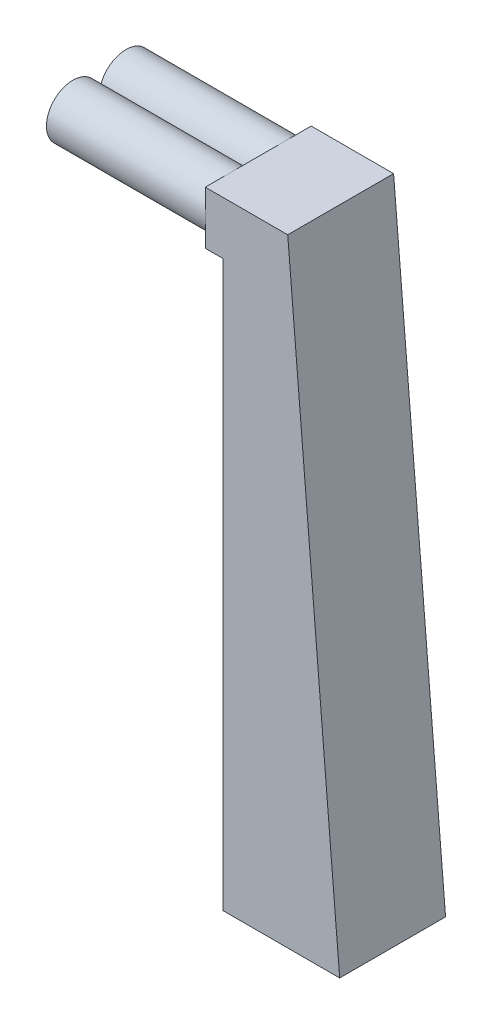
ISO-10303-21;
HEADER;
FILE_DESCRIPTION(('STEP AP214'),'2;1');
FILE_NAME('part.step','',(''),(''),'','','');
FILE_SCHEMA(('AUTOMOTIVE_DESIGN { 1 0 10303 214 1 1 1 1 }'));
ENDSEC;
DATA;
#1=APPLICATION_CONTEXT('core data for automotive mechanical design processes');
#2=APPLICATION_PROTOCOL_DEFINITION('international standard','automotive_design',2000,#1);
#3=PRODUCT_CONTEXT('',#1,'mechanical');
#4=PRODUCT('Part','Part','',(#3));
#5=PRODUCT_RELATED_PRODUCT_CATEGORY('part','',(#4));
#6=PRODUCT_DEFINITION_FORMATION('','',#4);
#7=PRODUCT_DEFINITION_CONTEXT('part definition',#1,'design');
#8=PRODUCT_DEFINITION('design','',#6,#7);
#9=PRODUCT_DEFINITION_SHAPE('','',#8);
#10=(LENGTH_UNIT() NAMED_UNIT(*) SI_UNIT(.MILLI.,.METRE.));
#11=(NAMED_UNIT(*) PLANE_ANGLE_UNIT() SI_UNIT($,.RADIAN.));
#12=(NAMED_UNIT(*) SI_UNIT($,.STERADIAN.) SOLID_ANGLE_UNIT());
#13=UNCERTAINTY_MEASURE_WITH_UNIT(LENGTH_MEASURE(1.E-05),#10,'distance_accuracy_value','');
#14=(GEOMETRIC_REPRESENTATION_CONTEXT(3) GLOBAL_UNCERTAINTY_ASSIGNED_CONTEXT((#13)) GLOBAL_UNIT_ASSIGNED_CONTEXT((#10,
#11,#12)) REPRESENTATION_CONTEXT('',''));
#15=CARTESIAN_POINT('',(0.,0.,0.));
#16=DIRECTION('',(0.,0.,1.));
#17=DIRECTION('',(1.,0.,0.));
#18=AXIS2_PLACEMENT_3D('',#15,#16,#17);
#19=CARTESIAN_POINT('',(-15.3842228890631,350.,-30.));
#20=DIRECTION('',(-1.,0.,0.));
#21=DIRECTION('',(0.,-1.,0.));
#22=AXIS2_PLACEMENT_3D('',#19,#20,#21);
#23=PLANE('',#22);
#24=DIRECTION('',(0.,-1.,0.));
#25=VECTOR('',#24,1.);
#26=CARTESIAN_POINT('',(-15.3842228890631,350.,30.));
#27=LINE('',#26,#25);
#28=CARTESIAN_POINT('',(-15.3842228890631,320.,30.));
#29=VERTEX_POINT('',#28);
#30=CARTESIAN_POINT('',(-15.384222889063,0.,30.));
#31=VERTEX_POINT('',#30);
#32=EDGE_CURVE('E181',#29,#31,#27,.T.);
#33=ORIENTED_EDGE('',*,*,#32,.F.);
#34=DIRECTION('',(0.,0.,1.));
#35=VECTOR('',#34,1.);
#36=CARTESIAN_POINT('',(-15.3842228890631,320.,-30.));
#37=LINE('',#36,#35);
#38=CARTESIAN_POINT('',(-15.3842228890631,320.,-30.));
#39=VERTEX_POINT('',#38);
#40=EDGE_CURVE('E51',#39,#29,#37,.T.);
#41=ORIENTED_EDGE('',*,*,#40,.F.);
#42=DIRECTION('',(0.,-1.,0.));
#43=VECTOR('',#42,1.);
#44=CARTESIAN_POINT('',(-15.3842228890631,350.,-30.));
#45=LINE('',#44,#43);
#46=CARTESIAN_POINT('',(-15.384222889063,0.,-30.));
#47=VERTEX_POINT('',#46);
#48=EDGE_CURVE('E152',#39,#47,#45,.T.);
#49=ORIENTED_EDGE('',*,*,#48,.T.);
#50=DIRECTION('',(0.,0.,1.));
#51=VECTOR('',#50,1.);
#52=CARTESIAN_POINT('',(-15.384222889063,0.,-30.));
#53=LINE('',#52,#51);
#54=EDGE_CURVE('E208',#47,#31,#53,.T.);
#55=ORIENTED_EDGE('',*,*,#54,.T.);
#56=EDGE_LOOP('',(#33,#41,#49,#55));
#57=FACE_BOUND('',#56,.T.);
#58=ADVANCED_FACE('F36',(#57),#23,.T.);
#59=CARTESIAN_POINT('',(21.3359412593151,350.,-30.));
#60=DIRECTION('',(0.,1.,0.));
#61=DIRECTION('',(0.,0.,1.));
#62=AXIS2_PLACEMENT_3D('',#59,#60,#61);
#63=PLANE('',#62);
#64=DIRECTION('',(-1.,0.,0.));
#65=VECTOR('',#64,1.);
#66=CARTESIAN_POINT('',(21.3359412593151,350.,-30.));
#67=LINE('',#66,#65);
#68=CARTESIAN_POINT('',(21.3359412593151,350.,-30.));
#69=VERTEX_POINT('',#68);
#70=CARTESIAN_POINT('',(-25.3842228890631,350.,-30.));
#71=VERTEX_POINT('',#70);
#72=EDGE_CURVE('E206',#69,#71,#67,.T.);
#73=ORIENTED_EDGE('',*,*,#72,.T.);
#74=DIRECTION('',(0.,0.,-1.));
#75=VECTOR('',#74,1.);
#76=CARTESIAN_POINT('',(-25.3842228890631,350.,-30.));
#77=LINE('',#76,#75);
#78=CARTESIAN_POINT('',(-25.3842228890631,350.,-15.));
#79=VERTEX_POINT('',#78);
#80=EDGE_CURVE('E242',#79,#71,#77,.T.);
#81=ORIENTED_EDGE('',*,*,#80,.F.);
#82=CARTESIAN_POINT('',(-25.3842228890631,350.,15.));
#83=VERTEX_POINT('',#82);
#84=EDGE_CURVE('E244',#83,#79,#77,.T.);
#85=ORIENTED_EDGE('',*,*,#84,.F.);
#86=CARTESIAN_POINT('',(-25.3842228890631,350.,30.));
#87=VERTEX_POINT('',#86);
#88=EDGE_CURVE('E159',#87,#83,#77,.T.);
#89=ORIENTED_EDGE('',*,*,#88,.F.);
#90=DIRECTION('',(-1.,0.,0.));
#91=VECTOR('',#90,1.);
#92=CARTESIAN_POINT('',(21.3359412593151,350.,30.));
#93=LINE('',#92,#91);
#94=CARTESIAN_POINT('',(21.3359412593151,350.,30.));
#95=VERTEX_POINT('',#94);
#96=EDGE_CURVE('E197',#95,#87,#93,.T.);
#97=ORIENTED_EDGE('',*,*,#96,.F.);
#98=DIRECTION('',(0.,0.,1.));
#99=VECTOR('',#98,1.);
#100=CARTESIAN_POINT('',(21.3359412593151,350.,-30.));
#101=LINE('',#100,#99);
#102=EDGE_CURVE('E209',#69,#95,#101,.T.);
#103=ORIENTED_EDGE('',*,*,#102,.F.);
#104=EDGE_LOOP('',(#73,#81,#85,#89,#97,#103));
#105=FACE_BOUND('',#104,.T.);
#106=ADVANCED_FACE('F228',(#105),#63,.T.);
#107=CARTESIAN_POINT('',(50.7837940200514,0.,-30.));
#108=DIRECTION('',(0.996479187842912,0.0838404925792461,0.));
#109=DIRECTION('',(-0.0838404925792462,0.996479187842912,0.));
#110=AXIS2_PLACEMENT_3D('',#107,#108,#109);
#111=PLANE('',#110);
#112=ORIENTED_EDGE('',*,*,#102,.T.);
#113=DIRECTION('',(-0.0838404925792461,0.996479187842912,0.));
#114=VECTOR('',#113,1.);
#115=CARTESIAN_POINT('',(50.7837940200514,0.,30.));
#116=LINE('',#115,#114);
#117=CARTESIAN_POINT('',(50.7837940200514,0.,30.));
#118=VERTEX_POINT('',#117);
#119=EDGE_CURVE('E194',#118,#95,#116,.T.);
#120=ORIENTED_EDGE('',*,*,#119,.F.);
#121=DIRECTION('',(0.,0.,1.));
#122=VECTOR('',#121,1.);
#123=CARTESIAN_POINT('',(50.7837940200514,0.,-30.));
#124=LINE('',#123,#122);
#125=CARTESIAN_POINT('',(50.7837940200514,0.,-30.));
#126=VERTEX_POINT('',#125);
#127=EDGE_CURVE('E211',#126,#118,#124,.T.);
#128=ORIENTED_EDGE('',*,*,#127,.F.);
#129=DIRECTION('',(-0.0838404925792461,0.996479187842912,0.));
#130=VECTOR('',#129,1.);
#131=CARTESIAN_POINT('',(50.7837940200514,0.,-30.));
#132=LINE('',#131,#130);
#133=EDGE_CURVE('E203',#126,#69,#132,.T.);
#134=ORIENTED_EDGE('',*,*,#133,.T.);
#135=EDGE_LOOP('',(#112,#120,#128,#134));
#136=FACE_BOUND('',#135,.T.);
#137=ADVANCED_FACE('F224',(#136),#111,.T.);
#138=CARTESIAN_POINT('',(-15.384222889063,0.,-30.));
#139=DIRECTION('',(0.,-1.,0.));
#140=DIRECTION('',(0.,0.,-1.));
#141=AXIS2_PLACEMENT_3D('',#138,#139,#140);
#142=PLANE('',#141);
#143=ORIENTED_EDGE('',*,*,#127,.T.);
#144=DIRECTION('',(1.,0.,0.));
#145=VECTOR('',#144,1.);
#146=CARTESIAN_POINT('',(-15.384222889063,0.,30.));
#147=LINE('',#146,#145);
#148=EDGE_CURVE('E191',#31,#118,#147,.T.);
#149=ORIENTED_EDGE('',*,*,#148,.F.);
#150=ORIENTED_EDGE('',*,*,#54,.F.);
#151=DIRECTION('',(1.,0.,0.));
#152=VECTOR('',#151,1.);
#153=CARTESIAN_POINT('',(-15.384222889063,0.,-30.));
#154=LINE('',#153,#152);
#155=EDGE_CURVE('E200',#47,#126,#154,.T.);
#156=ORIENTED_EDGE('',*,*,#155,.T.);
#157=EDGE_LOOP('',(#143,#149,#150,#156));
#158=FACE_BOUND('',#157,.T.);
#159=ADVANCED_FACE('F218',(#158),#142,.T.);
#160=CARTESIAN_POINT('',(0.,0.,-30.));
#161=DIRECTION('',(0.,0.,1.));
#162=DIRECTION('',(1.,0.,0.));
#163=AXIS2_PLACEMENT_3D('',#160,#161,#162);
#164=PLANE('',#163);
#165=DIRECTION('',(0.,-1.,0.));
#166=VECTOR('',#165,1.);
#167=CARTESIAN_POINT('',(-25.3842228890631,350.,-30.));
#168=LINE('',#167,#166);
#169=CARTESIAN_POINT('',(-25.3842228890631,335.,-30.));
#170=VERTEX_POINT('',#169);
#171=EDGE_CURVE('E142',#71,#170,#168,.T.);
#172=ORIENTED_EDGE('',*,*,#171,.F.);
#173=ORIENTED_EDGE('',*,*,#72,.F.);
#174=ORIENTED_EDGE('',*,*,#133,.F.);
#175=ORIENTED_EDGE('',*,*,#155,.F.);
#176=ORIENTED_EDGE('',*,*,#48,.F.);
#177=DIRECTION('',(1.,0.,0.));
#178=VECTOR('',#177,1.);
#179=CARTESIAN_POINT('',(-25.3842228890631,320.,-30.));
#180=LINE('',#179,#178);
#181=CARTESIAN_POINT('',(-25.3842228890631,320.,-30.));
#182=VERTEX_POINT('',#181);
#183=EDGE_CURVE('E145',#182,#39,#180,.T.);
#184=ORIENTED_EDGE('',*,*,#183,.F.);
#185=EDGE_CURVE('E132',#170,#182,#168,.T.);
#186=ORIENTED_EDGE('',*,*,#185,.F.);
#187=EDGE_LOOP('',(#172,#173,#174,#175,#176,#184,#186));
#188=FACE_BOUND('',#187,.T.);
#189=ADVANCED_FACE('F150',(#188),#164,.F.);
#190=CARTESIAN_POINT('',(0.,0.,30.));
#191=DIRECTION('',(0.,0.,1.));
#192=DIRECTION('',(1.,0.,0.));
#193=AXIS2_PLACEMENT_3D('',#190,#191,#192);
#194=PLANE('',#193);
#195=ORIENTED_EDGE('',*,*,#96,.T.);
#196=DIRECTION('',(0.,1.,0.));
#197=VECTOR('',#196,1.);
#198=CARTESIAN_POINT('',(-25.3842228890631,350.,30.));
#199=LINE('',#198,#197);
#200=CARTESIAN_POINT('',(-25.3842228890631,335.,30.));
#201=VERTEX_POINT('',#200);
#202=EDGE_CURVE('E147',#201,#87,#199,.T.);
#203=ORIENTED_EDGE('',*,*,#202,.F.);
#204=CARTESIAN_POINT('',(-25.3842228890631,320.,30.));
#205=VERTEX_POINT('',#204);
#206=EDGE_CURVE('E240',#205,#201,#199,.T.);
#207=ORIENTED_EDGE('',*,*,#206,.F.);
#208=DIRECTION('',(1.,0.,0.));
#209=VECTOR('',#208,1.);
#210=CARTESIAN_POINT('',(-25.3842228890631,320.,30.));
#211=LINE('',#210,#209);
#212=EDGE_CURVE('E154',#205,#29,#211,.T.);
#213=ORIENTED_EDGE('',*,*,#212,.T.);
#214=ORIENTED_EDGE('',*,*,#32,.T.);
#215=ORIENTED_EDGE('',*,*,#148,.T.);
#216=ORIENTED_EDGE('',*,*,#119,.T.);
#217=EDGE_LOOP('',(#195,#203,#207,#213,#214,#215,#216));
#218=FACE_BOUND('',#217,.T.);
#219=ADVANCED_FACE('F221',(#218),#194,.T.);
#220=CARTESIAN_POINT('',(-25.3842228890631,320.,-30.));
#221=DIRECTION('',(0.,1.,0.));
#222=DIRECTION('',(-1.,0.,0.));
#223=AXIS2_PLACEMENT_3D('',#220,#221,#222);
#224=PLANE('',#223);
#225=DIRECTION('',(0.,0.,1.));
#226=VECTOR('',#225,1.);
#227=CARTESIAN_POINT('',(-25.3842228890631,320.,-30.));
#228=LINE('',#227,#226);
#229=CARTESIAN_POINT('',(-25.3842228890631,320.,-15.));
#230=VERTEX_POINT('',#229);
#231=CARTESIAN_POINT('',(-25.3842228890631,320.,15.));
#232=VERTEX_POINT('',#231);
#233=EDGE_CURVE('E59',#230,#232,#228,.T.);
#234=ORIENTED_EDGE('',*,*,#233,.F.);
#235=EDGE_CURVE('E135',#182,#230,#228,.T.);
#236=ORIENTED_EDGE('',*,*,#235,.F.);
#237=ORIENTED_EDGE('',*,*,#183,.T.);
#238=ORIENTED_EDGE('',*,*,#40,.T.);
#239=ORIENTED_EDGE('',*,*,#212,.F.);
#240=EDGE_CURVE('E149',#232,#205,#228,.T.);
#241=ORIENTED_EDGE('',*,*,#240,.F.);
#242=EDGE_LOOP('',(#234,#236,#237,#238,#239,#241));
#243=FACE_BOUND('',#242,.T.);
#244=ADVANCED_FACE('F144',(#243),#224,.F.);
#245=CARTESIAN_POINT('',(-25.384222889063,0.,0.));
#246=DIRECTION('',(-1.,0.,0.));
#247=DIRECTION('',(0.,-1.,0.));
#248=AXIS2_PLACEMENT_3D('',#245,#246,#247);
#249=PLANE('',#248);
#250=CARTESIAN_POINT('',(-25.3842228890631,335.,15.));
#251=DIRECTION('',(-1.,0.,0.));
#252=DIRECTION('',(0.,-1.,0.));
#253=AXIS2_PLACEMENT_3D('',#250,#251,#252);
#254=CIRCLE('',#253,15.);
#255=CARTESIAN_POINT('',(-25.3842228890631,335.990281696541,0.0327242905899441));
#256=VERTEX_POINT('',#255);
#257=EDGE_CURVE('E44',#83,#256,#254,.T.);
#258=ORIENTED_EDGE('',*,*,#257,.F.);
#259=ORIENTED_EDGE('',*,*,#84,.T.);
#260=CARTESIAN_POINT('',(-25.3842228890631,335.,-15.));
#261=DIRECTION('',(-1.,0.,0.));
#262=DIRECTION('',(0.,-1.,0.));
#263=AXIS2_PLACEMENT_3D('',#260,#261,#262);
#264=CIRCLE('',#263,15.);
#265=CARTESIAN_POINT('',(-25.3842228890631,335.990281696541,-0.0327242905899354));
#266=VERTEX_POINT('',#265);
#267=EDGE_CURVE('E165',#266,#79,#264,.T.);
#268=ORIENTED_EDGE('',*,*,#267,.F.);
#269=DIRECTION('',(0.,0.,1.));
#270=VECTOR('',#269,1.);
#271=CARTESIAN_POINT('',(-25.3842228890631,335.990281696541,-0.0327242905899371));
#272=LINE('',#271,#270);
#273=EDGE_CURVE('E166',#266,#256,#272,.T.);
#274=ORIENTED_EDGE('',*,*,#273,.T.);
#275=EDGE_LOOP('',(#258,#259,#268,#274));
#276=FACE_BOUND('',#275,.T.);
#277=ADVANCED_FACE('F272',(#276),#249,.T.);
#278=EDGE_CURVE('E249',#79,#170,#264,.T.);
#279=ORIENTED_EDGE('',*,*,#278,.F.);
#280=ORIENTED_EDGE('',*,*,#80,.T.);
#281=ORIENTED_EDGE('',*,*,#171,.T.);
#282=EDGE_LOOP('',(#279,#280,#281));
#283=FACE_BOUND('',#282,.T.);
#284=ADVANCED_FACE('F247',(#283),#249,.T.);
#285=EDGE_CURVE('E137',#170,#230,#264,.T.);
#286=ORIENTED_EDGE('',*,*,#285,.F.);
#287=ORIENTED_EDGE('',*,*,#185,.T.);
#288=ORIENTED_EDGE('',*,*,#235,.T.);
#289=EDGE_LOOP('',(#286,#287,#288));
#290=FACE_BOUND('',#289,.T.);
#291=ADVANCED_FACE('F134',(#290),#249,.T.);
#292=EDGE_CURVE('E11',#201,#83,#254,.T.);
#293=ORIENTED_EDGE('',*,*,#292,.F.);
#294=ORIENTED_EDGE('',*,*,#202,.T.);
#295=ORIENTED_EDGE('',*,*,#88,.T.);
#296=EDGE_LOOP('',(#293,#294,#295));
#297=FACE_BOUND('',#296,.T.);
#298=ADVANCED_FACE('F239',(#297),#249,.T.);
#299=CARTESIAN_POINT('',(-25.3842228890631,334.097782056361,-0.0271578255103544));
#300=VERTEX_POINT('',#299);
#301=EDGE_CURVE('E157',#230,#300,#264,.T.);
#302=ORIENTED_EDGE('',*,*,#301,.F.);
#303=ORIENTED_EDGE('',*,*,#233,.T.);
#304=CARTESIAN_POINT('',(-25.3842228890631,334.097782056361,0.0271578255103613));
#305=VERTEX_POINT('',#304);
#306=EDGE_CURVE('E39',#305,#232,#254,.T.);
#307=ORIENTED_EDGE('',*,*,#306,.F.);
#308=DIRECTION('',(0.,0.,1.));
#309=VECTOR('',#308,1.);
#310=CARTESIAN_POINT('',(-25.3842228890631,334.097782056361,-0.0271578255103527));
#311=LINE('',#310,#309);
#312=EDGE_CURVE('E153',#300,#305,#311,.T.);
#313=ORIENTED_EDGE('',*,*,#312,.F.);
#314=EDGE_LOOP('',(#302,#303,#307,#313));
#315=FACE_BOUND('',#314,.T.);
#316=ADVANCED_FACE('F260',(#315),#249,.T.);
#317=EDGE_CURVE('E254',#232,#201,#254,.T.);
#318=ORIENTED_EDGE('',*,*,#317,.F.);
#319=ORIENTED_EDGE('',*,*,#240,.T.);
#320=ORIENTED_EDGE('',*,*,#206,.T.);
#321=EDGE_LOOP('',(#318,#319,#320));
#322=FACE_BOUND('',#321,.T.);
#323=ADVANCED_FACE('F252',(#322),#249,.T.);
#324=CARTESIAN_POINT('',(-115.384222889063,335.,15.));
#325=DIRECTION('',(-1.,0.,0.));
#326=DIRECTION('',(0.,0.,1.));
#327=AXIS2_PLACEMENT_3D('',#324,#325,#326);
#328=PLANE('',#327);
#329=DIRECTION('',(0.,0.,1.));
#330=VECTOR('',#329,1.);
#331=CARTESIAN_POINT('',(-115.384222889063,335.990281696541,-0.0327242905899371));
#332=LINE('',#331,#330);
#333=CARTESIAN_POINT('',(-115.384222889063,335.990281696541,-0.0327242905899354));
#334=VERTEX_POINT('',#333);
#335=CARTESIAN_POINT('',(-115.384222889063,335.990281696541,0.0327242905899441));
#336=VERTEX_POINT('',#335);
#337=EDGE_CURVE('E168',#334,#336,#332,.T.);
#338=ORIENTED_EDGE('',*,*,#337,.F.);
#339=CARTESIAN_POINT('',(-115.384222889063,335.,-15.));
#340=DIRECTION('',(-1.,0.,0.));
#341=DIRECTION('',(0.,0.,1.));
#342=AXIS2_PLACEMENT_3D('',#339,#340,#341);
#343=CIRCLE('',#342,15.);
#344=CARTESIAN_POINT('',(-115.384222889063,334.097782056361,-0.0271578255103544));
#345=VERTEX_POINT('',#344);
#346=EDGE_CURVE('E175',#334,#345,#343,.T.);
#347=ORIENTED_EDGE('',*,*,#346,.T.);
#348=DIRECTION('',(0.,0.,1.));
#349=VECTOR('',#348,1.);
#350=CARTESIAN_POINT('',(-115.384222889063,334.097782056361,-0.0271578255103527));
#351=LINE('',#350,#349);
#352=CARTESIAN_POINT('',(-115.384222889063,334.097782056361,0.0271578255103613));
#353=VERTEX_POINT('',#352);
#354=EDGE_CURVE('E173',#345,#353,#351,.T.);
#355=ORIENTED_EDGE('',*,*,#354,.T.);
#356=CARTESIAN_POINT('',(-115.384222889063,335.,15.));
#357=DIRECTION('',(-1.,0.,0.));
#358=DIRECTION('',(0.,0.,1.));
#359=AXIS2_PLACEMENT_3D('',#356,#357,#358);
#360=CIRCLE('',#359,15.);
#361=EDGE_CURVE('E171',#353,#336,#360,.T.);
#362=ORIENTED_EDGE('',*,*,#361,.T.);
#363=EDGE_LOOP('',(#338,#347,#355,#362));
#364=FACE_BOUND('',#363,.T.);
#365=ADVANCED_FACE('F278',(#364),#328,.T.);
#366=CARTESIAN_POINT('',(-115.384222889063,335.,15.));
#367=DIRECTION('',(1.,0.,0.));
#368=DIRECTION('',(0.,0.,-1.));
#369=AXIS2_PLACEMENT_3D('',#366,#367,#368);
#370=CYLINDRICAL_SURFACE('',#369,15.);
#371=ORIENTED_EDGE('',*,*,#317,.T.);
#372=ORIENTED_EDGE('',*,*,#292,.T.);
#373=ORIENTED_EDGE('',*,*,#257,.T.);
#374=DIRECTION('',(1.,0.,0.));
#375=VECTOR('',#374,1.);
#376=CARTESIAN_POINT('',(-115.384222889063,335.990281696541,0.0327242905899441));
#377=LINE('',#376,#375);
#378=EDGE_CURVE('E177',#336,#256,#377,.T.);
#379=ORIENTED_EDGE('',*,*,#378,.F.);
#380=ORIENTED_EDGE('',*,*,#361,.F.);
#381=DIRECTION('',(1.,0.,0.));
#382=VECTOR('',#381,1.);
#383=CARTESIAN_POINT('',(-115.384222889063,334.097782056361,0.0271578255103613));
#384=LINE('',#383,#382);
#385=EDGE_CURVE('E185',#353,#305,#384,.T.);
#386=ORIENTED_EDGE('',*,*,#385,.T.);
#387=ORIENTED_EDGE('',*,*,#306,.T.);
#388=EDGE_LOOP('',(#371,#372,#373,#379,#380,#386,#387));
#389=FACE_BOUND('',#388,.T.);
#390=ADVANCED_FACE('F257',(#389),#370,.T.);
#391=CARTESIAN_POINT('',(-115.384222889063,334.097782056361,-0.0271578255103527));
#392=DIRECTION('',(0.,1.,0.));
#393=DIRECTION('',(0.,0.,1.));
#394=AXIS2_PLACEMENT_3D('',#391,#392,#393);
#395=PLANE('',#394);
#396=DIRECTION('',(1.,0.,0.));
#397=VECTOR('',#396,1.);
#398=CARTESIAN_POINT('',(-115.384222889063,334.097782056361,-0.0271578255103544));
#399=LINE('',#398,#397);
#400=EDGE_CURVE('E182',#345,#300,#399,.T.);
#401=ORIENTED_EDGE('',*,*,#400,.T.);
#402=ORIENTED_EDGE('',*,*,#312,.T.);
#403=ORIENTED_EDGE('',*,*,#385,.F.);
#404=ORIENTED_EDGE('',*,*,#354,.F.);
#405=EDGE_LOOP('',(#401,#402,#403,#404));
#406=FACE_BOUND('',#405,.T.);
#407=ADVANCED_FACE('F262',(#406),#395,.F.);
#408=CARTESIAN_POINT('',(-115.384222889063,335.,-15.));
#409=DIRECTION('',(1.,0.,0.));
#410=DIRECTION('',(0.,0.,-1.));
#411=AXIS2_PLACEMENT_3D('',#408,#409,#410);
#412=CYLINDRICAL_SURFACE('',#411,15.);
#413=ORIENTED_EDGE('',*,*,#285,.T.);
#414=ORIENTED_EDGE('',*,*,#301,.T.);
#415=ORIENTED_EDGE('',*,*,#400,.F.);
#416=ORIENTED_EDGE('',*,*,#346,.F.);
#417=DIRECTION('',(1.,0.,0.));
#418=VECTOR('',#417,1.);
#419=CARTESIAN_POINT('',(-115.384222889063,335.990281696541,-0.0327242905899354));
#420=LINE('',#419,#418);
#421=EDGE_CURVE('E178',#334,#266,#420,.T.);
#422=ORIENTED_EDGE('',*,*,#421,.T.);
#423=ORIENTED_EDGE('',*,*,#267,.T.);
#424=ORIENTED_EDGE('',*,*,#278,.T.);
#425=EDGE_LOOP('',(#413,#414,#415,#416,#422,#423,#424));
#426=FACE_BOUND('',#425,.T.);
#427=ADVANCED_FACE('F267',(#426),#412,.T.);
#428=CARTESIAN_POINT('',(-115.384222889063,335.990281696541,-0.0327242905899371));
#429=DIRECTION('',(0.,1.,0.));
#430=DIRECTION('',(0.,0.,1.));
#431=AXIS2_PLACEMENT_3D('',#428,#429,#430);
#432=PLANE('',#431);
#433=ORIENTED_EDGE('',*,*,#273,.F.);
#434=ORIENTED_EDGE('',*,*,#421,.F.);
#435=ORIENTED_EDGE('',*,*,#337,.T.);
#436=ORIENTED_EDGE('',*,*,#378,.T.);
#437=EDGE_LOOP('',(#433,#434,#435,#436));
#438=FACE_BOUND('',#437,.T.);
#439=ADVANCED_FACE('F275',(#438),#432,.T.);
#440=CLOSED_SHELL('',(#58,#106,#137,#159,#189,#219,#244,#277,#284,#291,#298,#316,#323,#365,#390,
#407,#427,#439));
#441=MANIFOLD_SOLID_BREP('B2',#440);
#442=ADVANCED_BREP_SHAPE_REPRESENTATION('',(#18,#441),#14);
#443=SHAPE_DEFINITION_REPRESENTATION(#9,#442);
ENDSEC;
END-ISO-10303-21;
